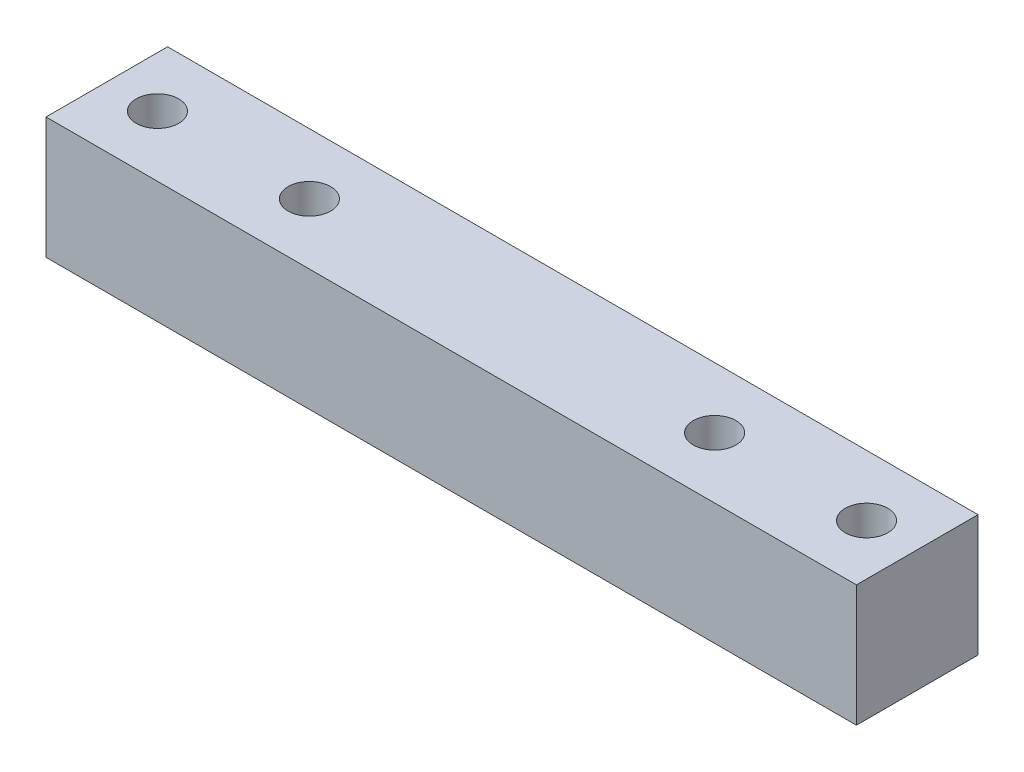
ISO-10303-21;
HEADER;
FILE_DESCRIPTION(('STEP AP214'),'2;1');
FILE_NAME('part.step','',(''),(''),'','','');
FILE_SCHEMA(('AUTOMOTIVE_DESIGN { 1 0 10303 214 1 1 1 1 }'));
ENDSEC;
DATA;
#1=APPLICATION_CONTEXT('core data for automotive mechanical design processes');
#2=APPLICATION_PROTOCOL_DEFINITION('international standard','automotive_design',2000,#1);
#3=PRODUCT_CONTEXT('',#1,'mechanical');
#4=PRODUCT('Part','Part','',(#3));
#5=PRODUCT_RELATED_PRODUCT_CATEGORY('part','',(#4));
#6=PRODUCT_DEFINITION_FORMATION('','',#4);
#7=PRODUCT_DEFINITION_CONTEXT('part definition',#1,'design');
#8=PRODUCT_DEFINITION('design','',#6,#7);
#9=PRODUCT_DEFINITION_SHAPE('','',#8);
#10=(LENGTH_UNIT() NAMED_UNIT(*) SI_UNIT(.MILLI.,.METRE.));
#11=(NAMED_UNIT(*) PLANE_ANGLE_UNIT() SI_UNIT($,.RADIAN.));
#12=(NAMED_UNIT(*) SI_UNIT($,.STERADIAN.) SOLID_ANGLE_UNIT());
#13=UNCERTAINTY_MEASURE_WITH_UNIT(LENGTH_MEASURE(1.E-05),#10,'distance_accuracy_value','');
#14=(GEOMETRIC_REPRESENTATION_CONTEXT(3) GLOBAL_UNCERTAINTY_ASSIGNED_CONTEXT((#13)) GLOBAL_UNIT_ASSIGNED_CONTEXT((#10,
#11,#12)) REPRESENTATION_CONTEXT('',''));
#15=CARTESIAN_POINT('',(0.,0.,0.));
#16=DIRECTION('',(0.,0.,1.));
#17=DIRECTION('',(1.,0.,0.));
#18=AXIS2_PLACEMENT_3D('',#15,#16,#17);
#19=CARTESIAN_POINT('',(-40.,12.,6.));
#20=DIRECTION('',(1.,0.,0.));
#21=DIRECTION('',(0.,0.,-1.));
#22=AXIS2_PLACEMENT_3D('',#19,#20,#21);
#23=PLANE('',#22);
#24=DIRECTION('',(0.,0.964541221524196,-0.263932248845441));
#25=VECTOR('',#24,1.);
#26=CARTESIAN_POINT('',(-40.,10.963509299188,0.));
#27=LINE('',#26,#25);
#28=CARTESIAN_POINT('',(-40.,0.,3.));
#29=VERTEX_POINT('',#28);
#30=CARTESIAN_POINT('',(-40.,10.963509299188,0.));
#31=VERTEX_POINT('',#30);
#32=EDGE_CURVE('E202',#29,#31,#27,.T.);
#33=ORIENTED_EDGE('',*,*,#32,.F.);
#34=DIRECTION('',(0.,0.,1.));
#35=VECTOR('',#34,1.);
#36=CARTESIAN_POINT('',(-40.,0.,6.));
#37=LINE('',#36,#35);
#38=CARTESIAN_POINT('',(-40.,0.,6.));
#39=VERTEX_POINT('',#38);
#40=EDGE_CURVE('E122',#29,#39,#37,.T.);
#41=ORIENTED_EDGE('',*,*,#40,.T.);
#42=DIRECTION('',(0.,-1.,0.));
#43=VECTOR('',#42,1.);
#44=CARTESIAN_POINT('',(-40.,12.,6.));
#45=LINE('',#44,#43);
#46=CARTESIAN_POINT('',(-40.,12.,6.));
#47=VERTEX_POINT('',#46);
#48=EDGE_CURVE('E11',#47,#39,#45,.T.);
#49=ORIENTED_EDGE('',*,*,#48,.F.);
#50=DIRECTION('',(0.,0.,1.));
#51=VECTOR('',#50,1.);
#52=CARTESIAN_POINT('',(-40.,12.,6.));
#53=LINE('',#52,#51);
#54=CARTESIAN_POINT('',(-40.,12.,-6.));
#55=VERTEX_POINT('',#54);
#56=EDGE_CURVE('E156',#55,#47,#53,.T.);
#57=ORIENTED_EDGE('',*,*,#56,.F.);
#58=DIRECTION('',(0.,-1.,0.));
#59=VECTOR('',#58,1.);
#60=CARTESIAN_POINT('',(-40.,12.,-6.));
#61=LINE('',#60,#59);
#62=CARTESIAN_POINT('',(-40.,0.,-6.));
#63=VERTEX_POINT('',#62);
#64=EDGE_CURVE('E165',#55,#63,#61,.T.);
#65=ORIENTED_EDGE('',*,*,#64,.T.);
#66=CARTESIAN_POINT('',(-40.,0.,-3.));
#67=VERTEX_POINT('',#66);
#68=EDGE_CURVE('E162',#63,#67,#37,.T.);
#69=ORIENTED_EDGE('',*,*,#68,.T.);
#70=DIRECTION('',(0.,-0.964541221524196,-0.263932248845441));
#71=VECTOR('',#70,1.);
#72=CARTESIAN_POINT('',(-40.,0.,-3.));
#73=LINE('',#72,#71);
#74=EDGE_CURVE('E119',#31,#67,#73,.T.);
#75=ORIENTED_EDGE('',*,*,#74,.F.);
#76=EDGE_LOOP('',(#33,#41,#49,#57,#65,#69,#75));
#77=FACE_BOUND('',#76,.T.);
#78=ADVANCED_FACE('F39',(#77),#23,.F.);
#79=CARTESIAN_POINT('',(40.,12.,5.99999999999999));
#80=DIRECTION('',(0.,0.,-1.));
#81=DIRECTION('',(-1.,0.,0.));
#82=AXIS2_PLACEMENT_3D('',#79,#80,#81);
#83=PLANE('',#82);
#84=DIRECTION('',(1.,0.,0.));
#85=VECTOR('',#84,1.);
#86=CARTESIAN_POINT('',(40.,0.,5.99999999999999));
#87=LINE('',#86,#85);
#88=CARTESIAN_POINT('',(40.,0.,5.99999999999999));
#89=VERTEX_POINT('',#88);
#90=EDGE_CURVE('E167',#39,#89,#87,.T.);
#91=ORIENTED_EDGE('',*,*,#90,.T.);
#92=DIRECTION('',(0.,-1.,0.));
#93=VECTOR('',#92,1.);
#94=CARTESIAN_POINT('',(40.,12.,5.99999999999999));
#95=LINE('',#94,#93);
#96=CARTESIAN_POINT('',(40.,12.,5.99999999999999));
#97=VERTEX_POINT('',#96);
#98=EDGE_CURVE('E46',#97,#89,#95,.T.);
#99=ORIENTED_EDGE('',*,*,#98,.F.);
#100=DIRECTION('',(1.,0.,0.));
#101=VECTOR('',#100,1.);
#102=CARTESIAN_POINT('',(40.,12.,5.99999999999999));
#103=LINE('',#102,#101);
#104=EDGE_CURVE('E89',#47,#97,#103,.T.);
#105=ORIENTED_EDGE('',*,*,#104,.F.);
#106=ORIENTED_EDGE('',*,*,#48,.T.);
#107=EDGE_LOOP('',(#91,#99,#105,#106));
#108=FACE_BOUND('',#107,.T.);
#109=ADVANCED_FACE('F194',(#108),#83,.F.);
#110=CARTESIAN_POINT('',(40.,12.,5.99999999999999));
#111=DIRECTION('',(-1.,0.,0.));
#112=DIRECTION('',(0.,0.,1.));
#113=AXIS2_PLACEMENT_3D('',#110,#111,#112);
#114=PLANE('',#113);
#115=DIRECTION('',(0.,0.,-1.));
#116=VECTOR('',#115,1.);
#117=CARTESIAN_POINT('',(40.,0.,5.99999999999999));
#118=LINE('',#117,#116);
#119=CARTESIAN_POINT('',(40.,0.,-6.00000000000001));
#120=VERTEX_POINT('',#119);
#121=EDGE_CURVE('E169',#89,#120,#118,.T.);
#122=ORIENTED_EDGE('',*,*,#121,.T.);
#123=DIRECTION('',(0.,-1.,0.));
#124=VECTOR('',#123,1.);
#125=CARTESIAN_POINT('',(40.,12.,-6.00000000000001));
#126=LINE('',#125,#124);
#127=CARTESIAN_POINT('',(40.,12.,-6.00000000000001));
#128=VERTEX_POINT('',#127);
#129=EDGE_CURVE('E175',#128,#120,#126,.T.);
#130=ORIENTED_EDGE('',*,*,#129,.F.);
#131=DIRECTION('',(0.,0.,-1.));
#132=VECTOR('',#131,1.);
#133=CARTESIAN_POINT('',(40.,12.,5.99999999999999));
#134=LINE('',#133,#132);
#135=EDGE_CURVE('E157',#97,#128,#134,.T.);
#136=ORIENTED_EDGE('',*,*,#135,.F.);
#137=ORIENTED_EDGE('',*,*,#98,.T.);
#138=EDGE_LOOP('',(#122,#130,#136,#137));
#139=FACE_BOUND('',#138,.T.);
#140=ADVANCED_FACE('F180',(#139),#114,.F.);
#141=CARTESIAN_POINT('',(40.,12.,-6.00000000000001));
#142=DIRECTION('',(0.,0.,1.));
#143=DIRECTION('',(1.,0.,0.));
#144=AXIS2_PLACEMENT_3D('',#141,#142,#143);
#145=PLANE('',#144);
#146=DIRECTION('',(-1.,0.,0.));
#147=VECTOR('',#146,1.);
#148=CARTESIAN_POINT('',(40.,0.,-6.00000000000001));
#149=LINE('',#148,#147);
#150=EDGE_CURVE('E81',#120,#63,#149,.T.);
#151=ORIENTED_EDGE('',*,*,#150,.T.);
#152=ORIENTED_EDGE('',*,*,#64,.F.);
#153=DIRECTION('',(-1.,0.,0.));
#154=VECTOR('',#153,1.);
#155=CARTESIAN_POINT('',(40.,12.,-6.00000000000001));
#156=LINE('',#155,#154);
#157=EDGE_CURVE('E65',#128,#55,#156,.T.);
#158=ORIENTED_EDGE('',*,*,#157,.F.);
#159=ORIENTED_EDGE('',*,*,#129,.T.);
#160=EDGE_LOOP('',(#151,#152,#158,#159));
#161=FACE_BOUND('',#160,.T.);
#162=ADVANCED_FACE('F184',(#161),#145,.F.);
#163=CARTESIAN_POINT('',(0.,12.,0.));
#164=DIRECTION('',(0.,1.,0.));
#165=DIRECTION('',(0.,0.,1.));
#166=AXIS2_PLACEMENT_3D('',#163,#164,#165);
#167=PLANE('',#166);
#168=CARTESIAN_POINT('',(35.,12.,0.));
#169=DIRECTION('',(0.,1.,0.));
#170=DIRECTION('',(0.,0.,1.));
#171=AXIS2_PLACEMENT_3D('',#168,#169,#170);
#172=CIRCLE('',#171,2.1);
#173=CARTESIAN_POINT('',(35.,12.,2.1));
#174=VERTEX_POINT('',#173);
#175=EDGE_CURVE('E132',#174,#174,#172,.T.);
#176=ORIENTED_EDGE('',*,*,#175,.F.);
#177=EDGE_LOOP('',(#176));
#178=FACE_BOUND('',#177,.T.);
#179=CARTESIAN_POINT('',(20.,12.,0.));
#180=DIRECTION('',(0.,1.,0.));
#181=DIRECTION('',(0.,0.,1.));
#182=AXIS2_PLACEMENT_3D('',#179,#180,#181);
#183=CIRCLE('',#182,2.1);
#184=CARTESIAN_POINT('',(20.,12.,2.1));
#185=VERTEX_POINT('',#184);
#186=EDGE_CURVE('E136',#185,#185,#183,.T.);
#187=ORIENTED_EDGE('',*,*,#186,.F.);
#188=EDGE_LOOP('',(#187));
#189=FACE_BOUND('',#188,.T.);
#190=CARTESIAN_POINT('',(-20.,12.,0.));
#191=DIRECTION('',(0.,1.,0.));
#192=DIRECTION('',(0.,0.,-1.));
#193=AXIS2_PLACEMENT_3D('',#190,#191,#192);
#194=CIRCLE('',#193,2.1);
#195=CARTESIAN_POINT('',(-20.,12.,-2.1));
#196=VERTEX_POINT('',#195);
#197=EDGE_CURVE('E145',#196,#196,#194,.T.);
#198=ORIENTED_EDGE('',*,*,#197,.F.);
#199=EDGE_LOOP('',(#198));
#200=FACE_BOUND('',#199,.T.);
#201=CARTESIAN_POINT('',(-35.,12.,0.));
#202=DIRECTION('',(0.,1.,0.));
#203=DIRECTION('',(0.,0.,-1.));
#204=AXIS2_PLACEMENT_3D('',#201,#202,#203);
#205=CIRCLE('',#204,2.1);
#206=CARTESIAN_POINT('',(-35.,12.,-2.09999999999999));
#207=VERTEX_POINT('',#206);
#208=EDGE_CURVE('E147',#207,#207,#205,.T.);
#209=ORIENTED_EDGE('',*,*,#208,.F.);
#210=EDGE_LOOP('',(#209));
#211=FACE_BOUND('',#210,.T.);
#212=ORIENTED_EDGE('',*,*,#56,.T.);
#213=ORIENTED_EDGE('',*,*,#104,.T.);
#214=ORIENTED_EDGE('',*,*,#135,.T.);
#215=ORIENTED_EDGE('',*,*,#157,.T.);
#216=EDGE_LOOP('',(#212,#213,#214,#215));
#217=FACE_BOUND('',#216,.T.);
#218=ADVANCED_FACE('F188',(#178,#189,#200,#211,#217),#167,.T.);
#219=CARTESIAN_POINT('',(0.,0.,0.));
#220=DIRECTION('',(0.,1.,0.));
#221=DIRECTION('',(0.,0.,1.));
#222=AXIS2_PLACEMENT_3D('',#219,#220,#221);
#223=PLANE('',#222);
#224=DIRECTION('',(0.,0.,1.));
#225=VECTOR('',#224,1.);
#226=CARTESIAN_POINT('',(-39.8,0.,3.));
#227=LINE('',#226,#225);
#228=CARTESIAN_POINT('',(-39.8,0.,-3.));
#229=VERTEX_POINT('',#228);
#230=CARTESIAN_POINT('',(-39.8,0.,3.));
#231=VERTEX_POINT('',#230);
#232=EDGE_CURVE('E114',#229,#231,#227,.T.);
#233=ORIENTED_EDGE('',*,*,#232,.F.);
#234=DIRECTION('',(-1.,0.,0.));
#235=VECTOR('',#234,1.);
#236=CARTESIAN_POINT('',(-39.8,0.,-3.));
#237=LINE('',#236,#235);
#238=EDGE_CURVE('E130',#229,#67,#237,.T.);
#239=ORIENTED_EDGE('',*,*,#238,.T.);
#240=ORIENTED_EDGE('',*,*,#68,.F.);
#241=ORIENTED_EDGE('',*,*,#150,.F.);
#242=ORIENTED_EDGE('',*,*,#121,.F.);
#243=ORIENTED_EDGE('',*,*,#90,.F.);
#244=ORIENTED_EDGE('',*,*,#40,.F.);
#245=DIRECTION('',(-1.,0.,0.));
#246=VECTOR('',#245,1.);
#247=CARTESIAN_POINT('',(-39.8,0.,3.));
#248=LINE('',#247,#246);
#249=EDGE_CURVE('E109',#231,#29,#248,.T.);
#250=ORIENTED_EDGE('',*,*,#249,.F.);
#251=EDGE_LOOP('',(#233,#239,#240,#241,#242,#243,#244,#250));
#252=FACE_BOUND('',#251,.T.);
#253=CARTESIAN_POINT('',(35.,0.,0.));
#254=DIRECTION('',(0.,1.,0.));
#255=DIRECTION('',(0.,0.,1.));
#256=AXIS2_PLACEMENT_3D('',#253,#254,#255);
#257=CIRCLE('',#256,2.1);
#258=CARTESIAN_POINT('',(35.,0.,2.1));
#259=VERTEX_POINT('',#258);
#260=EDGE_CURVE('E135',#259,#259,#257,.T.);
#261=ORIENTED_EDGE('',*,*,#260,.T.);
#262=EDGE_LOOP('',(#261));
#263=FACE_BOUND('',#262,.T.);
#264=CARTESIAN_POINT('',(20.,0.,0.));
#265=DIRECTION('',(0.,1.,0.));
#266=DIRECTION('',(0.,0.,1.));
#267=AXIS2_PLACEMENT_3D('',#264,#265,#266);
#268=CIRCLE('',#267,2.1);
#269=CARTESIAN_POINT('',(20.,0.,2.1));
#270=VERTEX_POINT('',#269);
#271=EDGE_CURVE('E143',#270,#270,#268,.T.);
#272=ORIENTED_EDGE('',*,*,#271,.T.);
#273=EDGE_LOOP('',(#272));
#274=FACE_BOUND('',#273,.T.);
#275=CARTESIAN_POINT('',(-20.,0.,0.));
#276=DIRECTION('',(0.,1.,0.));
#277=DIRECTION('',(0.,0.,-1.));
#278=AXIS2_PLACEMENT_3D('',#275,#276,#277);
#279=CIRCLE('',#278,2.1);
#280=CARTESIAN_POINT('',(-20.,0.,-2.1));
#281=VERTEX_POINT('',#280);
#282=EDGE_CURVE('E150',#281,#281,#279,.T.);
#283=ORIENTED_EDGE('',*,*,#282,.T.);
#284=EDGE_LOOP('',(#283));
#285=FACE_BOUND('',#284,.T.);
#286=CARTESIAN_POINT('',(-35.,0.,0.));
#287=DIRECTION('',(0.,1.,0.));
#288=DIRECTION('',(0.,0.,-1.));
#289=AXIS2_PLACEMENT_3D('',#286,#287,#288);
#290=CIRCLE('',#289,2.1);
#291=CARTESIAN_POINT('',(-35.,0.,-2.09999999999999));
#292=VERTEX_POINT('',#291);
#293=EDGE_CURVE('E153',#292,#292,#290,.T.);
#294=ORIENTED_EDGE('',*,*,#293,.T.);
#295=EDGE_LOOP('',(#294));
#296=FACE_BOUND('',#295,.T.);
#297=ADVANCED_FACE('F125',(#252,#263,#274,#285,#296),#223,.F.);
#298=CARTESIAN_POINT('',(-35.,0.,0.));
#299=DIRECTION('',(0.,1.,0.));
#300=DIRECTION('',(0.,0.,1.));
#301=AXIS2_PLACEMENT_3D('',#298,#299,#300);
#302=CYLINDRICAL_SURFACE('',#301,2.1);
#303=ORIENTED_EDGE('',*,*,#293,.F.);
#304=EDGE_LOOP('',(#303));
#305=FACE_BOUND('',#304,.T.);
#306=ORIENTED_EDGE('',*,*,#208,.T.);
#307=EDGE_LOOP('',(#306));
#308=FACE_BOUND('',#307,.T.);
#309=ADVANCED_FACE('F226',(#305,#308),#302,.F.);
#310=CARTESIAN_POINT('',(-20.,0.,0.));
#311=DIRECTION('',(0.,1.,0.));
#312=DIRECTION('',(0.,0.,1.));
#313=AXIS2_PLACEMENT_3D('',#310,#311,#312);
#314=CYLINDRICAL_SURFACE('',#313,2.1);
#315=ORIENTED_EDGE('',*,*,#282,.F.);
#316=EDGE_LOOP('',(#315));
#317=FACE_BOUND('',#316,.T.);
#318=ORIENTED_EDGE('',*,*,#197,.T.);
#319=EDGE_LOOP('',(#318));
#320=FACE_BOUND('',#319,.T.);
#321=ADVANCED_FACE('F221',(#317,#320),#314,.F.);
#322=CARTESIAN_POINT('',(20.,0.,0.));
#323=DIRECTION('',(0.,1.,0.));
#324=DIRECTION('',(0.,0.,1.));
#325=AXIS2_PLACEMENT_3D('',#322,#323,#324);
#326=CYLINDRICAL_SURFACE('',#325,2.1);
#327=ORIENTED_EDGE('',*,*,#271,.F.);
#328=EDGE_LOOP('',(#327));
#329=FACE_BOUND('',#328,.T.);
#330=ORIENTED_EDGE('',*,*,#186,.T.);
#331=EDGE_LOOP('',(#330));
#332=FACE_BOUND('',#331,.T.);
#333=ADVANCED_FACE('F220',(#329,#332),#326,.F.);
#334=CARTESIAN_POINT('',(35.,0.,0.));
#335=DIRECTION('',(0.,1.,0.));
#336=DIRECTION('',(0.,0.,1.));
#337=AXIS2_PLACEMENT_3D('',#334,#335,#336);
#338=CYLINDRICAL_SURFACE('',#337,2.1);
#339=ORIENTED_EDGE('',*,*,#260,.F.);
#340=EDGE_LOOP('',(#339));
#341=FACE_BOUND('',#340,.T.);
#342=ORIENTED_EDGE('',*,*,#175,.T.);
#343=EDGE_LOOP('',(#342));
#344=FACE_BOUND('',#343,.T.);
#345=ADVANCED_FACE('F211',(#341,#344),#338,.F.);
#346=CARTESIAN_POINT('',(-39.8,0.,-3.));
#347=DIRECTION('',(0.,0.263932248845441,-0.964541221524196));
#348=DIRECTION('',(0.,0.964541221524196,0.263932248845441));
#349=AXIS2_PLACEMENT_3D('',#346,#347,#348);
#350=PLANE('',#349);
#351=ORIENTED_EDGE('',*,*,#74,.T.);
#352=ORIENTED_EDGE('',*,*,#238,.F.);
#353=DIRECTION('',(0.,-0.964541221524196,-0.263932248845441));
#354=VECTOR('',#353,1.);
#355=CARTESIAN_POINT('',(-39.8,0.,-3.));
#356=LINE('',#355,#354);
#357=CARTESIAN_POINT('',(-39.8,10.963509299188,0.));
#358=VERTEX_POINT('',#357);
#359=EDGE_CURVE('E52',#358,#229,#356,.T.);
#360=ORIENTED_EDGE('',*,*,#359,.F.);
#361=DIRECTION('',(-1.,0.,0.));
#362=VECTOR('',#361,1.);
#363=CARTESIAN_POINT('',(-39.8,10.963509299188,0.));
#364=LINE('',#363,#362);
#365=EDGE_CURVE('E115',#358,#31,#364,.T.);
#366=ORIENTED_EDGE('',*,*,#365,.T.);
#367=EDGE_LOOP('',(#351,#352,#360,#366));
#368=FACE_BOUND('',#367,.T.);
#369=ADVANCED_FACE('F207',(#368),#350,.F.);
#370=CARTESIAN_POINT('',(-39.8,10.963509299188,0.));
#371=DIRECTION('',(0.,0.263932248845441,0.964541221524196));
#372=DIRECTION('',(0.,-0.964541221524196,0.263932248845441));
#373=AXIS2_PLACEMENT_3D('',#370,#371,#372);
#374=PLANE('',#373);
#375=ORIENTED_EDGE('',*,*,#32,.T.);
#376=ORIENTED_EDGE('',*,*,#365,.F.);
#377=DIRECTION('',(0.,0.964541221524196,-0.263932248845441));
#378=VECTOR('',#377,1.);
#379=CARTESIAN_POINT('',(-39.8,10.963509299188,0.));
#380=LINE('',#379,#378);
#381=EDGE_CURVE('E106',#231,#358,#380,.T.);
#382=ORIENTED_EDGE('',*,*,#381,.F.);
#383=ORIENTED_EDGE('',*,*,#249,.T.);
#384=EDGE_LOOP('',(#375,#376,#382,#383));
#385=FACE_BOUND('',#384,.T.);
#386=ADVANCED_FACE('F107',(#385),#374,.F.);
#387=CARTESIAN_POINT('',(-39.8,0.,0.));
#388=DIRECTION('',(1.,0.,0.));
#389=DIRECTION('',(0.,0.,-1.));
#390=AXIS2_PLACEMENT_3D('',#387,#388,#389);
#391=PLANE('',#390);
#392=ORIENTED_EDGE('',*,*,#232,.T.);
#393=ORIENTED_EDGE('',*,*,#381,.T.);
#394=ORIENTED_EDGE('',*,*,#359,.T.);
#395=EDGE_LOOP('',(#392,#393,#394));
#396=FACE_BOUND('',#395,.T.);
#397=ADVANCED_FACE('F118',(#396),#391,.F.);
#398=CLOSED_SHELL('',(#78,#109,#140,#162,#218,#297,#309,#321,#333,#345,#369,#386,#397));
#399=MANIFOLD_SOLID_BREP('B2',#398);
#400=ADVANCED_BREP_SHAPE_REPRESENTATION('',(#18,#399),#14);
#401=SHAPE_DEFINITION_REPRESENTATION(#9,#400);
ENDSEC;
END-ISO-10303-21;
